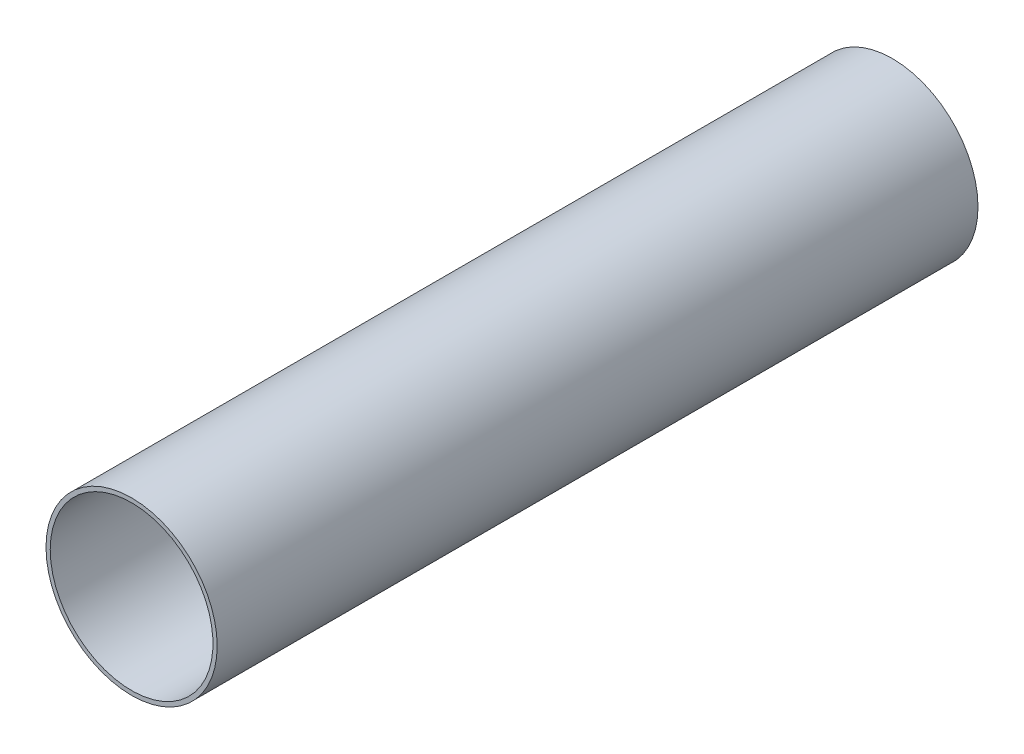
ISO-10303-21;
HEADER;
FILE_DESCRIPTION(('STEP AP214'),'2;1');
FILE_NAME('part.step','',(''),(''),'','','');
FILE_SCHEMA(('AUTOMOTIVE_DESIGN { 1 0 10303 214 1 1 1 1 }'));
ENDSEC;
DATA;
#1=APPLICATION_CONTEXT('core data for automotive mechanical design processes');
#2=APPLICATION_PROTOCOL_DEFINITION('international standard','automotive_design',2000,#1);
#3=PRODUCT_CONTEXT('',#1,'mechanical');
#4=PRODUCT('Part','Part','',(#3));
#5=PRODUCT_RELATED_PRODUCT_CATEGORY('part','',(#4));
#6=PRODUCT_DEFINITION_FORMATION('','',#4);
#7=PRODUCT_DEFINITION_CONTEXT('part definition',#1,'design');
#8=PRODUCT_DEFINITION('design','',#6,#7);
#9=PRODUCT_DEFINITION_SHAPE('','',#8);
#10=(LENGTH_UNIT() NAMED_UNIT(*) SI_UNIT(.MILLI.,.METRE.));
#11=(NAMED_UNIT(*) PLANE_ANGLE_UNIT() SI_UNIT($,.RADIAN.));
#12=(NAMED_UNIT(*) SI_UNIT($,.STERADIAN.) SOLID_ANGLE_UNIT());
#13=UNCERTAINTY_MEASURE_WITH_UNIT(LENGTH_MEASURE(1.E-05),#10,'distance_accuracy_value','');
#14=(GEOMETRIC_REPRESENTATION_CONTEXT(3) GLOBAL_UNCERTAINTY_ASSIGNED_CONTEXT((#13)) GLOBAL_UNIT_ASSIGNED_CONTEXT((#10,
#11,#12)) REPRESENTATION_CONTEXT('',''));
#15=CARTESIAN_POINT('',(0.,0.,0.));
#16=DIRECTION('',(0.,0.,1.));
#17=DIRECTION('',(1.,0.,0.));
#18=AXIS2_PLACEMENT_3D('',#15,#16,#17);
#19=CARTESIAN_POINT('',(0.,0.,180.));
#20=DIRECTION('',(0.,0.,1.));
#21=DIRECTION('',(1.,0.,0.));
#22=AXIS2_PLACEMENT_3D('',#19,#20,#21);
#23=PLANE('',#22);
#24=CARTESIAN_POINT('',(0.,0.,180.));
#25=DIRECTION('',(0.,0.,1.));
#26=DIRECTION('',(1.,0.,0.));
#27=AXIS2_PLACEMENT_3D('',#24,#25,#26);
#28=CIRCLE('',#27,20.25);
#29=CARTESIAN_POINT('',(-20.25,0.,180.));
#30=VERTEX_POINT('',#29);
#31=EDGE_CURVE('E10',#30,#30,#28,.T.);
#32=ORIENTED_EDGE('',*,*,#31,.T.);
#33=EDGE_LOOP('',(#32));
#34=FACE_BOUND('',#33,.T.);
#35=CARTESIAN_POINT('',(0.,0.,180.));
#36=DIRECTION('',(0.,0.,1.));
#37=DIRECTION('',(1.,0.,0.));
#38=AXIS2_PLACEMENT_3D('',#35,#36,#37);
#39=CIRCLE('',#38,19.25);
#40=CARTESIAN_POINT('',(-19.25,0.,180.));
#41=VERTEX_POINT('',#40);
#42=EDGE_CURVE('E42',#41,#41,#39,.T.);
#43=ORIENTED_EDGE('',*,*,#42,.F.);
#44=EDGE_LOOP('',(#43));
#45=FACE_BOUND('',#44,.T.);
#46=ADVANCED_FACE('F31',(#34,#45),#23,.T.);
#47=CARTESIAN_POINT('',(0.,0.,0.));
#48=DIRECTION('',(0.,0.,1.));
#49=DIRECTION('',(1.,0.,0.));
#50=AXIS2_PLACEMENT_3D('',#47,#48,#49);
#51=PLANE('',#50);
#52=CARTESIAN_POINT('',(0.,0.,0.));
#53=DIRECTION('',(0.,0.,1.));
#54=DIRECTION('',(1.,0.,0.));
#55=AXIS2_PLACEMENT_3D('',#52,#53,#54);
#56=CIRCLE('',#55,20.25);
#57=CARTESIAN_POINT('',(-20.25,0.,0.));
#58=VERTEX_POINT('',#57);
#59=EDGE_CURVE('E35',#58,#58,#56,.T.);
#60=ORIENTED_EDGE('',*,*,#59,.F.);
#61=EDGE_LOOP('',(#60));
#62=FACE_BOUND('',#61,.T.);
#63=CARTESIAN_POINT('',(0.,0.,0.));
#64=DIRECTION('',(0.,0.,1.));
#65=DIRECTION('',(1.,0.,0.));
#66=AXIS2_PLACEMENT_3D('',#63,#64,#65);
#67=CIRCLE('',#66,19.25);
#68=CARTESIAN_POINT('',(-19.25,0.,0.));
#69=VERTEX_POINT('',#68);
#70=EDGE_CURVE('E44',#69,#69,#67,.T.);
#71=ORIENTED_EDGE('',*,*,#70,.T.);
#72=EDGE_LOOP('',(#71));
#73=FACE_BOUND('',#72,.T.);
#74=ADVANCED_FACE('F54',(#62,#73),#51,.F.);
#75=CARTESIAN_POINT('',(0.,0.,180.));
#76=DIRECTION('',(0.,0.,-1.));
#77=DIRECTION('',(-1.,0.,0.));
#78=AXIS2_PLACEMENT_3D('',#75,#76,#77);
#79=CYLINDRICAL_SURFACE('',#78,20.25);
#80=CARTESIAN_POINT('',(-20.25,0.,180.));
#81=CARTESIAN_POINT('',(-20.25,0.,178.125));
#82=CARTESIAN_POINT('',(-20.25,0.,176.25));
#83=CARTESIAN_POINT('',(-20.25,0.,172.5));
#84=CARTESIAN_POINT('',(-20.25,0.,170.625));
#85=CARTESIAN_POINT('',(-20.25,0.,166.875));
#86=CARTESIAN_POINT('',(-20.25,0.,165.));
#87=CARTESIAN_POINT('',(-20.25,0.,161.25));
#88=CARTESIAN_POINT('',(-20.25,0.,159.375));
#89=CARTESIAN_POINT('',(-20.25,0.,155.625));
#90=CARTESIAN_POINT('',(-20.25,0.,153.75));
#91=CARTESIAN_POINT('',(-20.25,0.,150.));
#92=CARTESIAN_POINT('',(-20.25,0.,148.125));
#93=CARTESIAN_POINT('',(-20.25,0.,144.375));
#94=CARTESIAN_POINT('',(-20.25,0.,142.5));
#95=CARTESIAN_POINT('',(-20.25,0.,138.75));
#96=CARTESIAN_POINT('',(-20.25,0.,136.875));
#97=CARTESIAN_POINT('',(-20.25,0.,133.125));
#98=CARTESIAN_POINT('',(-20.25,0.,131.25));
#99=CARTESIAN_POINT('',(-20.25,0.,127.5));
#100=CARTESIAN_POINT('',(-20.25,0.,125.625));
#101=CARTESIAN_POINT('',(-20.25,0.,121.875));
#102=CARTESIAN_POINT('',(-20.25,0.,120.));
#103=CARTESIAN_POINT('',(-20.25,0.,116.25));
#104=CARTESIAN_POINT('',(-20.25,0.,114.375));
#105=CARTESIAN_POINT('',(-20.25,0.,110.625));
#106=CARTESIAN_POINT('',(-20.25,0.,108.75));
#107=CARTESIAN_POINT('',(-20.25,0.,105.));
#108=CARTESIAN_POINT('',(-20.25,0.,103.125));
#109=CARTESIAN_POINT('',(-20.25,0.,99.375));
#110=CARTESIAN_POINT('',(-20.25,0.,97.5));
#111=CARTESIAN_POINT('',(-20.25,0.,93.75));
#112=CARTESIAN_POINT('',(-20.25,0.,91.875));
#113=CARTESIAN_POINT('',(-20.25,0.,88.125));
#114=CARTESIAN_POINT('',(-20.25,0.,86.25));
#115=CARTESIAN_POINT('',(-20.25,0.,82.5));
#116=CARTESIAN_POINT('',(-20.25,0.,80.625));
#117=CARTESIAN_POINT('',(-20.25,0.,76.875));
#118=CARTESIAN_POINT('',(-20.25,0.,75.));
#119=CARTESIAN_POINT('',(-20.25,0.,71.25));
#120=CARTESIAN_POINT('',(-20.25,0.,69.375));
#121=CARTESIAN_POINT('',(-20.25,0.,65.625));
#122=CARTESIAN_POINT('',(-20.25,0.,63.75));
#123=CARTESIAN_POINT('',(-20.25,0.,60.));
#124=CARTESIAN_POINT('',(-20.25,0.,58.125));
#125=CARTESIAN_POINT('',(-20.25,0.,54.375));
#126=CARTESIAN_POINT('',(-20.25,0.,52.5));
#127=CARTESIAN_POINT('',(-20.25,0.,48.75));
#128=CARTESIAN_POINT('',(-20.25,0.,46.875));
#129=CARTESIAN_POINT('',(-20.25,0.,43.125));
#130=CARTESIAN_POINT('',(-20.25,0.,41.25));
#131=CARTESIAN_POINT('',(-20.25,0.,37.5));
#132=CARTESIAN_POINT('',(-20.25,0.,35.625));
#133=CARTESIAN_POINT('',(-20.25,0.,31.875));
#134=CARTESIAN_POINT('',(-20.25,0.,30.));
#135=CARTESIAN_POINT('',(-20.25,0.,26.25));
#136=CARTESIAN_POINT('',(-20.25,0.,24.375));
#137=CARTESIAN_POINT('',(-20.25,0.,20.625));
#138=CARTESIAN_POINT('',(-20.25,0.,18.75));
#139=CARTESIAN_POINT('',(-20.25,0.,15.));
#140=CARTESIAN_POINT('',(-20.25,0.,13.125));
#141=CARTESIAN_POINT('',(-20.25,0.,9.37499999999998));
#142=CARTESIAN_POINT('',(-20.25,0.,7.49999999999997));
#143=CARTESIAN_POINT('',(-20.25,0.,3.74999999999997));
#144=CARTESIAN_POINT('',(-20.25,0.,1.87499999999997));
#145=CARTESIAN_POINT('',(-20.25,0.,0.));
#146=B_SPLINE_CURVE_WITH_KNOTS('',3,(#80,#81,#82,#83,#84,#85,#86,#87,#88,#89,#90,#91,#92,#93,
#94,#95,#96,#97,#98,#99,#100,#101,#102,#103,#104,#105,#106,#107,#108,#109,#110,#111,#112,#113,
#114,#115,#116,#117,#118,#119,#120,#121,#122,#123,#124,#125,#126,#127,#128,#129,#130,#131,#132,
#133,#134,#135,#136,#137,#138,#139,#140,#141,#142,#143,#144,#145),.UNSPECIFIED.,.F.,.F.,(4,2,2,
2,2,2,2,2,2,2,2,2,2,2,2,2,2,2,2,2,2,2,2,2,2,2,2,2,2,2,2,2,4),(0.,5.62500000000002,11.25,16.875,
22.5,28.125,33.75,39.375,45.,50.625,56.25,61.875,67.5,73.125,78.75,84.375,90.,95.625,101.25,
106.875,112.5,118.125,123.75,129.375,135.,140.625,146.25,151.875,157.5,163.125,168.75,174.375,
180.),.UNSPECIFIED.);
#147=EDGE_CURVE('BSEAM33',#30,#58,#146,.T.);
#148=ORIENTED_EDGE('',*,*,#31,.F.);
#149=ORIENTED_EDGE('',*,*,#59,.T.);
#150=ORIENTED_EDGE('',*,*,#147,.T.);
#151=ORIENTED_EDGE('',*,*,#147,.F.);
#152=EDGE_LOOP('',(#148,#150,#149,#151));
#153=FACE_BOUND('',#152,.T.);
#154=ADVANCED_FACE('F33',(#153),#79,.T.);
#155=CARTESIAN_POINT('',(0.,0.,180.));
#156=DIRECTION('',(0.,0.,-1.));
#157=DIRECTION('',(-1.,0.,0.));
#158=AXIS2_PLACEMENT_3D('',#155,#156,#157);
#159=CYLINDRICAL_SURFACE('',#158,19.25);
#160=CARTESIAN_POINT('',(-19.25,0.,180.));
#161=CARTESIAN_POINT('',(-19.25,0.,178.125));
#162=CARTESIAN_POINT('',(-19.25,0.,176.25));
#163=CARTESIAN_POINT('',(-19.25,0.,172.5));
#164=CARTESIAN_POINT('',(-19.25,0.,170.625));
#165=CARTESIAN_POINT('',(-19.25,0.,166.875));
#166=CARTESIAN_POINT('',(-19.25,0.,165.));
#167=CARTESIAN_POINT('',(-19.25,0.,161.25));
#168=CARTESIAN_POINT('',(-19.25,0.,159.375));
#169=CARTESIAN_POINT('',(-19.25,0.,155.625));
#170=CARTESIAN_POINT('',(-19.25,0.,153.75));
#171=CARTESIAN_POINT('',(-19.25,0.,150.));
#172=CARTESIAN_POINT('',(-19.25,0.,148.125));
#173=CARTESIAN_POINT('',(-19.25,0.,144.375));
#174=CARTESIAN_POINT('',(-19.25,0.,142.5));
#175=CARTESIAN_POINT('',(-19.25,0.,138.75));
#176=CARTESIAN_POINT('',(-19.25,0.,136.875));
#177=CARTESIAN_POINT('',(-19.25,0.,133.125));
#178=CARTESIAN_POINT('',(-19.25,0.,131.25));
#179=CARTESIAN_POINT('',(-19.25,0.,127.5));
#180=CARTESIAN_POINT('',(-19.25,0.,125.625));
#181=CARTESIAN_POINT('',(-19.25,0.,121.875));
#182=CARTESIAN_POINT('',(-19.25,0.,120.));
#183=CARTESIAN_POINT('',(-19.25,0.,116.25));
#184=CARTESIAN_POINT('',(-19.25,0.,114.375));
#185=CARTESIAN_POINT('',(-19.25,0.,110.625));
#186=CARTESIAN_POINT('',(-19.25,0.,108.75));
#187=CARTESIAN_POINT('',(-19.25,0.,105.));
#188=CARTESIAN_POINT('',(-19.25,0.,103.125));
#189=CARTESIAN_POINT('',(-19.25,0.,99.375));
#190=CARTESIAN_POINT('',(-19.25,0.,97.5));
#191=CARTESIAN_POINT('',(-19.25,0.,93.75));
#192=CARTESIAN_POINT('',(-19.25,0.,91.875));
#193=CARTESIAN_POINT('',(-19.25,0.,88.125));
#194=CARTESIAN_POINT('',(-19.25,0.,86.25));
#195=CARTESIAN_POINT('',(-19.25,0.,82.5));
#196=CARTESIAN_POINT('',(-19.25,0.,80.625));
#197=CARTESIAN_POINT('',(-19.25,0.,76.875));
#198=CARTESIAN_POINT('',(-19.25,0.,75.));
#199=CARTESIAN_POINT('',(-19.25,0.,71.25));
#200=CARTESIAN_POINT('',(-19.25,0.,69.375));
#201=CARTESIAN_POINT('',(-19.25,0.,65.625));
#202=CARTESIAN_POINT('',(-19.25,0.,63.75));
#203=CARTESIAN_POINT('',(-19.25,0.,60.));
#204=CARTESIAN_POINT('',(-19.25,0.,58.125));
#205=CARTESIAN_POINT('',(-19.25,0.,54.375));
#206=CARTESIAN_POINT('',(-19.25,0.,52.5));
#207=CARTESIAN_POINT('',(-19.25,0.,48.75));
#208=CARTESIAN_POINT('',(-19.25,0.,46.875));
#209=CARTESIAN_POINT('',(-19.25,0.,43.125));
#210=CARTESIAN_POINT('',(-19.25,0.,41.25));
#211=CARTESIAN_POINT('',(-19.25,0.,37.5));
#212=CARTESIAN_POINT('',(-19.25,0.,35.625));
#213=CARTESIAN_POINT('',(-19.25,0.,31.875));
#214=CARTESIAN_POINT('',(-19.25,0.,30.));
#215=CARTESIAN_POINT('',(-19.25,0.,26.25));
#216=CARTESIAN_POINT('',(-19.25,0.,24.375));
#217=CARTESIAN_POINT('',(-19.25,0.,20.625));
#218=CARTESIAN_POINT('',(-19.25,0.,18.75));
#219=CARTESIAN_POINT('',(-19.25,0.,15.));
#220=CARTESIAN_POINT('',(-19.25,0.,13.125));
#221=CARTESIAN_POINT('',(-19.25,0.,9.37499999999998));
#222=CARTESIAN_POINT('',(-19.25,0.,7.49999999999997));
#223=CARTESIAN_POINT('',(-19.25,0.,3.74999999999997));
#224=CARTESIAN_POINT('',(-19.25,0.,1.87499999999997));
#225=CARTESIAN_POINT('',(-19.25,0.,0.));
#226=B_SPLINE_CURVE_WITH_KNOTS('',3,(#160,#161,#162,#163,#164,#165,#166,#167,#168,#169,#170,
#171,#172,#173,#174,#175,#176,#177,#178,#179,#180,#181,#182,#183,#184,#185,#186,#187,#188,#189,
#190,#191,#192,#193,#194,#195,#196,#197,#198,#199,#200,#201,#202,#203,#204,#205,#206,#207,#208,
#209,#210,#211,#212,#213,#214,#215,#216,#217,#218,#219,#220,#221,#222,#223,#224,#225),
.UNSPECIFIED.,.F.,.F.,(4,2,2,2,2,2,2,2,2,2,2,2,2,2,2,2,2,2,2,2,2,2,2,2,2,2,2,2,2,2,2,2,4),(0.,
5.62499999999999,11.25,16.875,22.5,28.125,33.75,39.375,45.,50.625,56.25,61.875,67.5,73.125,
78.75,84.375,90.,95.625,101.25,106.875,112.5,118.125,123.75,129.375,135.,140.625,146.25,151.875,
157.5,163.125,168.75,174.375,180.),.UNSPECIFIED.);
#227=EDGE_CURVE('BSEAM50',#41,#69,#226,.T.);
#228=ORIENTED_EDGE('',*,*,#42,.T.);
#229=ORIENTED_EDGE('',*,*,#70,.F.);
#230=ORIENTED_EDGE('',*,*,#227,.T.);
#231=ORIENTED_EDGE('',*,*,#227,.F.);
#232=EDGE_LOOP('',(#228,#230,#229,#231));
#233=FACE_BOUND('',#232,.T.);
#234=ADVANCED_FACE('F50',(#233),#159,.F.);
#235=CLOSED_SHELL('',(#46,#74,#154,#234));
#236=MANIFOLD_SOLID_BREP('B2',#235);
#237=ADVANCED_BREP_SHAPE_REPRESENTATION('',(#18,#236),#14);
#238=SHAPE_DEFINITION_REPRESENTATION(#9,#237);
ENDSEC;
END-ISO-10303-21;
